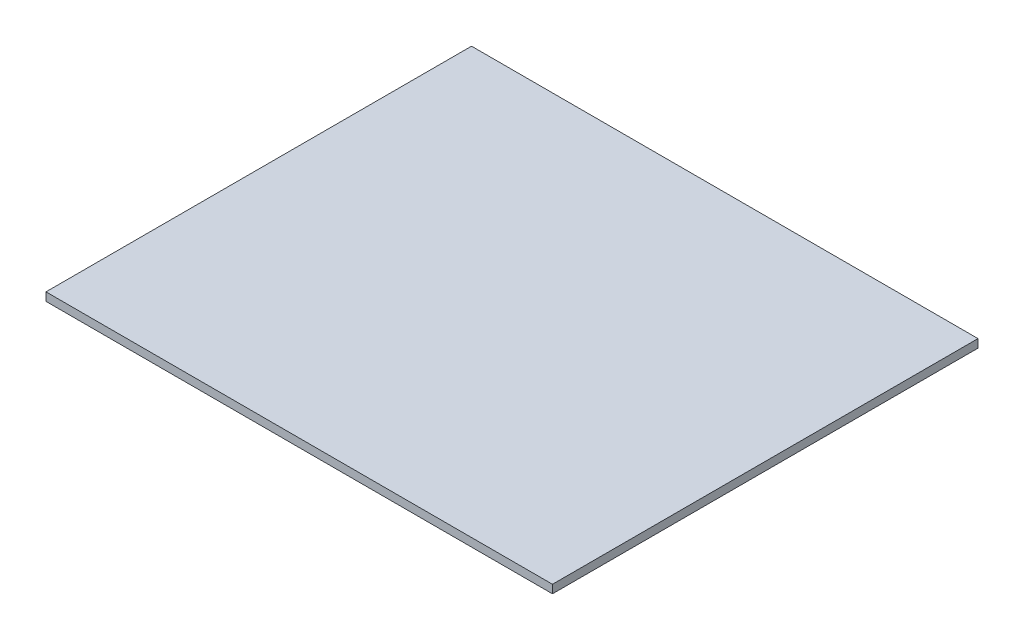
ISO-10303-21;
HEADER;
FILE_DESCRIPTION(('STEP AP214'),'2;1');
FILE_NAME('part.step','',(''),(''),'','','');
FILE_SCHEMA(('AUTOMOTIVE_DESIGN { 1 0 10303 214 1 1 1 1 }'));
ENDSEC;
DATA;
#1=APPLICATION_CONTEXT('core data for automotive mechanical design processes');
#2=APPLICATION_PROTOCOL_DEFINITION('international standard','automotive_design',2000,#1);
#3=PRODUCT_CONTEXT('',#1,'mechanical');
#4=PRODUCT('Part','Part','',(#3));
#5=PRODUCT_RELATED_PRODUCT_CATEGORY('part','',(#4));
#6=PRODUCT_DEFINITION_FORMATION('','',#4);
#7=PRODUCT_DEFINITION_CONTEXT('part definition',#1,'design');
#8=PRODUCT_DEFINITION('design','',#6,#7);
#9=PRODUCT_DEFINITION_SHAPE('','',#8);
#10=(LENGTH_UNIT() NAMED_UNIT(*) SI_UNIT(.MILLI.,.METRE.));
#11=(NAMED_UNIT(*) PLANE_ANGLE_UNIT() SI_UNIT($,.RADIAN.));
#12=(NAMED_UNIT(*) SI_UNIT($,.STERADIAN.) SOLID_ANGLE_UNIT());
#13=UNCERTAINTY_MEASURE_WITH_UNIT(LENGTH_MEASURE(1.E-05),#10,'distance_accuracy_value','');
#14=(GEOMETRIC_REPRESENTATION_CONTEXT(3) GLOBAL_UNCERTAINTY_ASSIGNED_CONTEXT((#13)) GLOBAL_UNIT_ASSIGNED_CONTEXT((#10,
#11,#12)) REPRESENTATION_CONTEXT('',''));
#15=CARTESIAN_POINT('',(0.,0.,0.));
#16=DIRECTION('',(0.,0.,1.));
#17=DIRECTION('',(1.,0.,0.));
#18=AXIS2_PLACEMENT_3D('',#15,#16,#17);
#19=CARTESIAN_POINT('',(0.,8.,0.));
#20=DIRECTION('',(1.,0.,0.));
#21=DIRECTION('',(0.,0.,-1.));
#22=AXIS2_PLACEMENT_3D('',#19,#20,#21);
#23=PLANE('',#22);
#24=DIRECTION('',(0.,0.,1.));
#25=VECTOR('',#24,1.);
#26=CARTESIAN_POINT('',(0.,0.,0.));
#27=LINE('',#26,#25);
#28=CARTESIAN_POINT('',(0.,0.,-410.));
#29=VERTEX_POINT('',#28);
#30=CARTESIAN_POINT('',(0.,0.,0.));
#31=VERTEX_POINT('',#30);
#32=EDGE_CURVE('E96',#29,#31,#27,.T.);
#33=ORIENTED_EDGE('',*,*,#32,.T.);
#34=DIRECTION('',(0.,-1.,0.));
#35=VECTOR('',#34,1.);
#36=CARTESIAN_POINT('',(0.,8.,0.));
#37=LINE('',#36,#35);
#38=CARTESIAN_POINT('',(0.,8.,0.));
#39=VERTEX_POINT('',#38);
#40=EDGE_CURVE('E11',#39,#31,#37,.T.);
#41=ORIENTED_EDGE('',*,*,#40,.F.);
#42=DIRECTION('',(0.,0.,1.));
#43=VECTOR('',#42,1.);
#44=CARTESIAN_POINT('',(0.,8.,0.));
#45=LINE('',#44,#43);
#46=CARTESIAN_POINT('',(0.,8.,-410.));
#47=VERTEX_POINT('',#46);
#48=EDGE_CURVE('E84',#47,#39,#45,.T.);
#49=ORIENTED_EDGE('',*,*,#48,.F.);
#50=DIRECTION('',(0.,-1.,0.));
#51=VECTOR('',#50,1.);
#52=CARTESIAN_POINT('',(0.,8.,-410.));
#53=LINE('',#52,#51);
#54=EDGE_CURVE('E92',#47,#29,#53,.T.);
#55=ORIENTED_EDGE('',*,*,#54,.T.);
#56=EDGE_LOOP('',(#33,#41,#49,#55));
#57=FACE_BOUND('',#56,.T.);
#58=ADVANCED_FACE('F33',(#57),#23,.F.);
#59=CARTESIAN_POINT('',(0.,8.,0.));
#60=DIRECTION('',(0.,0.,-1.));
#61=DIRECTION('',(-1.,0.,0.));
#62=AXIS2_PLACEMENT_3D('',#59,#60,#61);
#63=PLANE('',#62);
#64=DIRECTION('',(1.,0.,0.));
#65=VECTOR('',#64,1.);
#66=CARTESIAN_POINT('',(0.,0.,0.));
#67=LINE('',#66,#65);
#68=CARTESIAN_POINT('',(488.,0.,0.));
#69=VERTEX_POINT('',#68);
#70=EDGE_CURVE('E88',#31,#69,#67,.T.);
#71=ORIENTED_EDGE('',*,*,#70,.T.);
#72=DIRECTION('',(0.,-1.,0.));
#73=VECTOR('',#72,1.);
#74=CARTESIAN_POINT('',(488.,8.,0.));
#75=LINE('',#74,#73);
#76=CARTESIAN_POINT('',(488.,8.,0.));
#77=VERTEX_POINT('',#76);
#78=EDGE_CURVE('E41',#77,#69,#75,.T.);
#79=ORIENTED_EDGE('',*,*,#78,.F.);
#80=DIRECTION('',(1.,0.,0.));
#81=VECTOR('',#80,1.);
#82=CARTESIAN_POINT('',(0.,8.,0.));
#83=LINE('',#82,#81);
#84=EDGE_CURVE('E79',#39,#77,#83,.T.);
#85=ORIENTED_EDGE('',*,*,#84,.F.);
#86=ORIENTED_EDGE('',*,*,#40,.T.);
#87=EDGE_LOOP('',(#71,#79,#85,#86));
#88=FACE_BOUND('',#87,.T.);
#89=ADVANCED_FACE('F87',(#88),#63,.F.);
#90=CARTESIAN_POINT('',(488.,8.,0.));
#91=DIRECTION('',(-1.,0.,0.));
#92=DIRECTION('',(0.,0.,1.));
#93=AXIS2_PLACEMENT_3D('',#90,#91,#92);
#94=PLANE('',#93);
#95=DIRECTION('',(0.,0.,-1.));
#96=VECTOR('',#95,1.);
#97=CARTESIAN_POINT('',(488.,0.,0.));
#98=LINE('',#97,#96);
#99=CARTESIAN_POINT('',(488.,0.,-410.));
#100=VERTEX_POINT('',#99);
#101=EDGE_CURVE('E66',#69,#100,#98,.T.);
#102=ORIENTED_EDGE('',*,*,#101,.T.);
#103=DIRECTION('',(0.,-1.,0.));
#104=VECTOR('',#103,1.);
#105=CARTESIAN_POINT('',(488.,8.,-410.));
#106=LINE('',#105,#104);
#107=CARTESIAN_POINT('',(488.,8.,-410.));
#108=VERTEX_POINT('',#107);
#109=EDGE_CURVE('E89',#108,#100,#106,.T.);
#110=ORIENTED_EDGE('',*,*,#109,.F.);
#111=DIRECTION('',(0.,0.,-1.));
#112=VECTOR('',#111,1.);
#113=CARTESIAN_POINT('',(488.,8.,0.));
#114=LINE('',#113,#112);
#115=EDGE_CURVE('E82',#77,#108,#114,.T.);
#116=ORIENTED_EDGE('',*,*,#115,.F.);
#117=ORIENTED_EDGE('',*,*,#78,.T.);
#118=EDGE_LOOP('',(#102,#110,#116,#117));
#119=FACE_BOUND('',#118,.T.);
#120=ADVANCED_FACE('F90',(#119),#94,.F.);
#121=CARTESIAN_POINT('',(0.,8.,-410.));
#122=DIRECTION('',(0.,0.,1.));
#123=DIRECTION('',(1.,0.,0.));
#124=AXIS2_PLACEMENT_3D('',#121,#122,#123);
#125=PLANE('',#124);
#126=DIRECTION('',(-1.,0.,0.));
#127=VECTOR('',#126,1.);
#128=CARTESIAN_POINT('',(0.,0.,-410.));
#129=LINE('',#128,#127);
#130=EDGE_CURVE('E72',#100,#29,#129,.T.);
#131=ORIENTED_EDGE('',*,*,#130,.T.);
#132=ORIENTED_EDGE('',*,*,#54,.F.);
#133=DIRECTION('',(-1.,0.,0.));
#134=VECTOR('',#133,1.);
#135=CARTESIAN_POINT('',(0.,8.,-410.));
#136=LINE('',#135,#134);
#137=EDGE_CURVE('E49',#108,#47,#136,.T.);
#138=ORIENTED_EDGE('',*,*,#137,.F.);
#139=ORIENTED_EDGE('',*,*,#109,.T.);
#140=EDGE_LOOP('',(#131,#132,#138,#139));
#141=FACE_BOUND('',#140,.T.);
#142=ADVANCED_FACE('F103',(#141),#125,.F.);
#143=CARTESIAN_POINT('',(0.,8.,0.));
#144=DIRECTION('',(0.,-1.,0.));
#145=DIRECTION('',(0.,0.,-1.));
#146=AXIS2_PLACEMENT_3D('',#143,#144,#145);
#147=PLANE('',#146);
#148=ORIENTED_EDGE('',*,*,#48,.T.);
#149=ORIENTED_EDGE('',*,*,#84,.T.);
#150=ORIENTED_EDGE('',*,*,#115,.T.);
#151=ORIENTED_EDGE('',*,*,#137,.T.);
#152=EDGE_LOOP('',(#148,#149,#150,#151));
#153=FACE_BOUND('',#152,.T.);
#154=ADVANCED_FACE('F80',(#153),#147,.F.);
#155=CARTESIAN_POINT('',(0.,0.,0.));
#156=DIRECTION('',(0.,-1.,0.));
#157=DIRECTION('',(0.,0.,-1.));
#158=AXIS2_PLACEMENT_3D('',#155,#156,#157);
#159=PLANE('',#158);
#160=ORIENTED_EDGE('',*,*,#32,.F.);
#161=ORIENTED_EDGE('',*,*,#130,.F.);
#162=ORIENTED_EDGE('',*,*,#101,.F.);
#163=ORIENTED_EDGE('',*,*,#70,.F.);
#164=EDGE_LOOP('',(#160,#161,#162,#163));
#165=FACE_BOUND('',#164,.T.);
#166=ADVANCED_FACE('F106',(#165),#159,.T.);
#167=CLOSED_SHELL('',(#58,#89,#120,#142,#154,#166));
#168=MANIFOLD_SOLID_BREP('B2',#167);
#169=ADVANCED_BREP_SHAPE_REPRESENTATION('',(#18,#168),#14);
#170=SHAPE_DEFINITION_REPRESENTATION(#9,#169);
ENDSEC;
END-ISO-10303-21;
